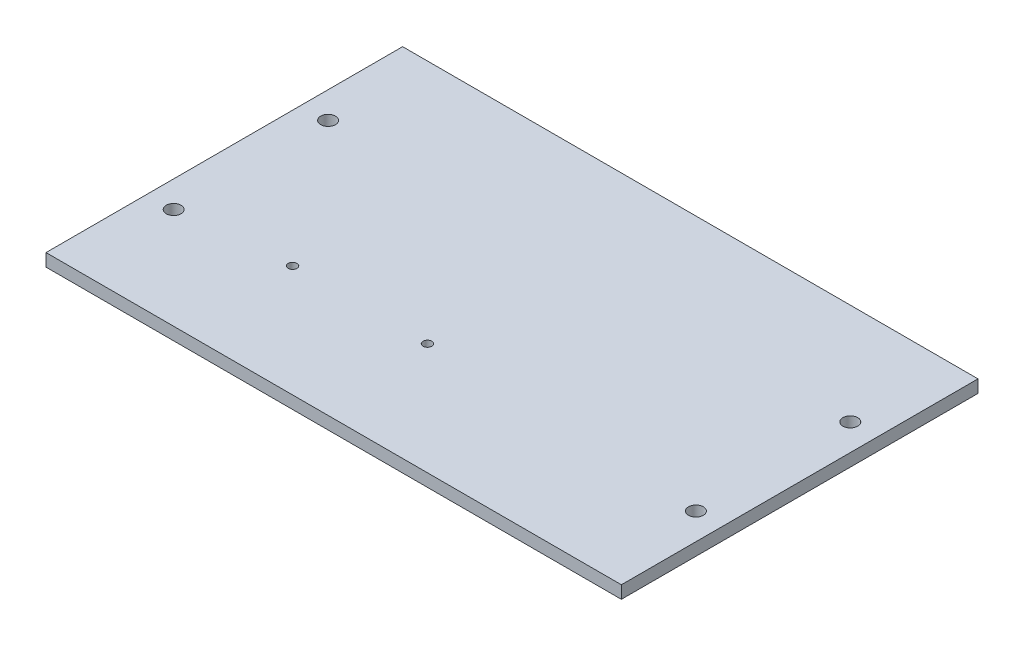
ISO-10303-21;
HEADER;
FILE_DESCRIPTION(('STEP AP214'),'2;1');
FILE_NAME('part.step','',(''),(''),'','','');
FILE_SCHEMA(('AUTOMOTIVE_DESIGN { 1 0 10303 214 1 1 1 1 }'));
ENDSEC;
DATA;
#1=APPLICATION_CONTEXT('core data for automotive mechanical design processes');
#2=APPLICATION_PROTOCOL_DEFINITION('international standard','automotive_design',2000,#1);
#3=PRODUCT_CONTEXT('',#1,'mechanical');
#4=PRODUCT('Part','Part','',(#3));
#5=PRODUCT_RELATED_PRODUCT_CATEGORY('part','',(#4));
#6=PRODUCT_DEFINITION_FORMATION('','',#4);
#7=PRODUCT_DEFINITION_CONTEXT('part definition',#1,'design');
#8=PRODUCT_DEFINITION('design','',#6,#7);
#9=PRODUCT_DEFINITION_SHAPE('','',#8);
#10=(LENGTH_UNIT() NAMED_UNIT(*) SI_UNIT(.MILLI.,.METRE.));
#11=(NAMED_UNIT(*) PLANE_ANGLE_UNIT() SI_UNIT($,.RADIAN.));
#12=(NAMED_UNIT(*) SI_UNIT($,.STERADIAN.) SOLID_ANGLE_UNIT());
#13=UNCERTAINTY_MEASURE_WITH_UNIT(LENGTH_MEASURE(1.E-05),#10,'distance_accuracy_value','');
#14=(GEOMETRIC_REPRESENTATION_CONTEXT(3) GLOBAL_UNCERTAINTY_ASSIGNED_CONTEXT((#13)) GLOBAL_UNIT_ASSIGNED_CONTEXT((#10,
#11,#12)) REPRESENTATION_CONTEXT('',''));
#15=CARTESIAN_POINT('',(0.,0.,0.));
#16=DIRECTION('',(0.,0.,1.));
#17=DIRECTION('',(1.,0.,0.));
#18=AXIS2_PLACEMENT_3D('',#15,#16,#17);
#19=CARTESIAN_POINT('',(0.,4.7625,0.));
#20=DIRECTION('',(0.,-1.,0.));
#21=DIRECTION('',(0.,0.,-1.));
#22=AXIS2_PLACEMENT_3D('',#19,#20,#21);
#23=PLANE('',#22);
#24=DIRECTION('',(0.,0.,1.));
#25=VECTOR('',#24,1.);
#26=CARTESIAN_POINT('',(0.,4.7625,0.));
#27=LINE('',#26,#25);
#28=CARTESIAN_POINT('',(0.,4.7625,-134.366));
#29=VERTEX_POINT('',#28);
#30=CARTESIAN_POINT('',(0.,4.7625,0.));
#31=VERTEX_POINT('',#30);
#32=EDGE_CURVE('E88',#29,#31,#27,.T.);
#33=ORIENTED_EDGE('',*,*,#32,.T.);
#34=DIRECTION('',(1.,0.,0.));
#35=VECTOR('',#34,1.);
#36=CARTESIAN_POINT('',(0.,4.7625,0.));
#37=LINE('',#36,#35);
#38=CARTESIAN_POINT('',(216.78392,4.7625,0.));
#39=VERTEX_POINT('',#38);
#40=EDGE_CURVE('E83',#31,#39,#37,.T.);
#41=ORIENTED_EDGE('',*,*,#40,.T.);
#42=DIRECTION('',(0.,0.,-1.));
#43=VECTOR('',#42,1.);
#44=CARTESIAN_POINT('',(216.78392,4.7625,0.));
#45=LINE('',#44,#43);
#46=CARTESIAN_POINT('',(216.78392,4.7625,-134.366));
#47=VERTEX_POINT('',#46);
#48=EDGE_CURVE('E86',#39,#47,#45,.T.);
#49=ORIENTED_EDGE('',*,*,#48,.T.);
#50=DIRECTION('',(-1.,0.,0.));
#51=VECTOR('',#50,1.);
#52=CARTESIAN_POINT('',(0.,4.7625,-134.366));
#53=LINE('',#52,#51);
#54=EDGE_CURVE('E53',#47,#29,#53,.T.);
#55=ORIENTED_EDGE('',*,*,#54,.T.);
#56=EDGE_LOOP('',(#33,#41,#49,#55));
#57=FACE_BOUND('',#56,.T.);
#58=CARTESIAN_POINT('',(50.8,4.7625,-42.1006735287375));
#59=DIRECTION('',(0.,1.,0.));
#60=DIRECTION('',(0.,0.,1.));
#61=AXIS2_PLACEMENT_3D('',#58,#59,#60);
#62=CIRCLE('',#61,1.65100000000001);
#63=CARTESIAN_POINT('',(50.8,4.7625,-43.7516735287375));
#64=VERTEX_POINT('',#63);
#65=EDGE_CURVE('E103',#64,#64,#62,.T.);
#66=ORIENTED_EDGE('',*,*,#65,.F.);
#67=EDGE_LOOP('',(#66));
#68=FACE_BOUND('',#67,.T.);
#69=CARTESIAN_POINT('',(101.6,4.7625,-42.1006735287375));
#70=DIRECTION('',(0.,1.,0.));
#71=DIRECTION('',(0.,0.,1.));
#72=AXIS2_PLACEMENT_3D('',#69,#70,#71);
#73=CIRCLE('',#72,1.65100000000002);
#74=CARTESIAN_POINT('',(101.6,4.7625,-43.7516735287375));
#75=VERTEX_POINT('',#74);
#76=EDGE_CURVE('E118',#75,#75,#73,.T.);
#77=ORIENTED_EDGE('',*,*,#76,.F.);
#78=EDGE_LOOP('',(#77));
#79=FACE_BOUND('',#78,.T.);
#80=CARTESIAN_POINT('',(10.0076,4.7625,-96.266));
#81=DIRECTION('',(0.,1.,0.));
#82=DIRECTION('',(0.,0.,1.));
#83=AXIS2_PLACEMENT_3D('',#80,#81,#82);
#84=CIRCLE('',#83,2.794);
#85=CARTESIAN_POINT('',(10.0076,4.7625,-99.06));
#86=VERTEX_POINT('',#85);
#87=EDGE_CURVE('E124',#86,#86,#84,.T.);
#88=ORIENTED_EDGE('',*,*,#87,.F.);
#89=EDGE_LOOP('',(#88));
#90=FACE_BOUND('',#89,.T.);
#91=CARTESIAN_POINT('',(10.0076,4.7625,-38.1));
#92=DIRECTION('',(0.,1.,0.));
#93=DIRECTION('',(0.,0.,1.));
#94=AXIS2_PLACEMENT_3D('',#91,#92,#93);
#95=CIRCLE('',#94,2.794);
#96=CARTESIAN_POINT('',(10.0076,4.7625,-40.894));
#97=VERTEX_POINT('',#96);
#98=EDGE_CURVE('E130',#97,#97,#95,.T.);
#99=ORIENTED_EDGE('',*,*,#98,.F.);
#100=EDGE_LOOP('',(#99));
#101=FACE_BOUND('',#100,.T.);
#102=CARTESIAN_POINT('',(206.77632,4.7625,-96.266));
#103=DIRECTION('',(0.,1.,0.));
#104=DIRECTION('',(0.,0.,1.));
#105=AXIS2_PLACEMENT_3D('',#102,#103,#104);
#106=CIRCLE('',#105,2.79399999999998);
#107=CARTESIAN_POINT('',(206.77632,4.7625,-99.06));
#108=VERTEX_POINT('',#107);
#109=EDGE_CURVE('E136',#108,#108,#106,.T.);
#110=ORIENTED_EDGE('',*,*,#109,.F.);
#111=EDGE_LOOP('',(#110));
#112=FACE_BOUND('',#111,.T.);
#113=CARTESIAN_POINT('',(206.77632,4.7625,-38.1));
#114=DIRECTION('',(0.,1.,0.));
#115=DIRECTION('',(0.,0.,1.));
#116=AXIS2_PLACEMENT_3D('',#113,#114,#115);
#117=CIRCLE('',#116,2.79399999999998);
#118=CARTESIAN_POINT('',(206.77632,4.7625,-40.894));
#119=VERTEX_POINT('',#118);
#120=EDGE_CURVE('E142',#119,#119,#117,.T.);
#121=ORIENTED_EDGE('',*,*,#120,.F.);
#122=EDGE_LOOP('',(#121));
#123=FACE_BOUND('',#122,.T.);
#124=ADVANCED_FACE('F36',(#57,#68,#79,#90,#101,#112,#123),#23,.F.);
#125=CARTESIAN_POINT('',(0.,0.,0.));
#126=DIRECTION('',(0.,-1.,0.));
#127=DIRECTION('',(0.,0.,-1.));
#128=AXIS2_PLACEMENT_3D('',#125,#126,#127);
#129=PLANE('',#128);
#130=CARTESIAN_POINT('',(206.77632,0.,-96.266));
#131=DIRECTION('',(0.,1.,0.));
#132=DIRECTION('',(0.,0.,1.));
#133=AXIS2_PLACEMENT_3D('',#130,#131,#132);
#134=CIRCLE('',#133,2.79399999999998);
#135=CARTESIAN_POINT('',(206.77632,0.,-99.06));
#136=VERTEX_POINT('',#135);
#137=EDGE_CURVE('E139',#136,#136,#134,.T.);
#138=ORIENTED_EDGE('',*,*,#137,.T.);
#139=EDGE_LOOP('',(#138));
#140=FACE_BOUND('',#139,.T.);
#141=CARTESIAN_POINT('',(10.0076,0.,-96.266));
#142=DIRECTION('',(0.,1.,0.));
#143=DIRECTION('',(0.,0.,1.));
#144=AXIS2_PLACEMENT_3D('',#141,#142,#143);
#145=CIRCLE('',#144,2.794);
#146=CARTESIAN_POINT('',(10.0076,0.,-99.06));
#147=VERTEX_POINT('',#146);
#148=EDGE_CURVE('E127',#147,#147,#145,.T.);
#149=ORIENTED_EDGE('',*,*,#148,.T.);
#150=EDGE_LOOP('',(#149));
#151=FACE_BOUND('',#150,.T.);
#152=CARTESIAN_POINT('',(50.8,0.,-42.1006735287375));
#153=DIRECTION('',(0.,1.,0.));
#154=DIRECTION('',(0.,0.,1.));
#155=AXIS2_PLACEMENT_3D('',#152,#153,#154);
#156=CIRCLE('',#155,1.65100000000001);
#157=CARTESIAN_POINT('',(50.8,0.,-43.7516735287375));
#158=VERTEX_POINT('',#157);
#159=EDGE_CURVE('E115',#158,#158,#156,.T.);
#160=ORIENTED_EDGE('',*,*,#159,.T.);
#161=EDGE_LOOP('',(#160));
#162=FACE_BOUND('',#161,.T.);
#163=DIRECTION('',(0.,0.,1.));
#164=VECTOR('',#163,1.);
#165=CARTESIAN_POINT('',(0.,0.,0.));
#166=LINE('',#165,#164);
#167=CARTESIAN_POINT('',(0.,0.,-134.366));
#168=VERTEX_POINT('',#167);
#169=CARTESIAN_POINT('',(0.,0.,0.));
#170=VERTEX_POINT('',#169);
#171=EDGE_CURVE('E100',#168,#170,#166,.T.);
#172=ORIENTED_EDGE('',*,*,#171,.F.);
#173=DIRECTION('',(-1.,0.,0.));
#174=VECTOR('',#173,1.);
#175=CARTESIAN_POINT('',(0.,0.,-134.366));
#176=LINE('',#175,#174);
#177=CARTESIAN_POINT('',(216.78392,0.,-134.366));
#178=VERTEX_POINT('',#177);
#179=EDGE_CURVE('E76',#178,#168,#176,.T.);
#180=ORIENTED_EDGE('',*,*,#179,.F.);
#181=DIRECTION('',(0.,0.,-1.));
#182=VECTOR('',#181,1.);
#183=CARTESIAN_POINT('',(216.78392,0.,0.));
#184=LINE('',#183,#182);
#185=CARTESIAN_POINT('',(216.78392,0.,0.));
#186=VERTEX_POINT('',#185);
#187=EDGE_CURVE('E70',#186,#178,#184,.T.);
#188=ORIENTED_EDGE('',*,*,#187,.F.);
#189=DIRECTION('',(1.,0.,0.));
#190=VECTOR('',#189,1.);
#191=CARTESIAN_POINT('',(0.,0.,0.));
#192=LINE('',#191,#190);
#193=EDGE_CURVE('E92',#170,#186,#192,.T.);
#194=ORIENTED_EDGE('',*,*,#193,.F.);
#195=EDGE_LOOP('',(#172,#180,#188,#194));
#196=FACE_BOUND('',#195,.T.);
#197=CARTESIAN_POINT('',(101.6,0.,-42.1006735287375));
#198=DIRECTION('',(0.,1.,0.));
#199=DIRECTION('',(0.,0.,1.));
#200=AXIS2_PLACEMENT_3D('',#197,#198,#199);
#201=CIRCLE('',#200,1.65100000000002);
#202=CARTESIAN_POINT('',(101.6,0.,-43.7516735287375));
#203=VERTEX_POINT('',#202);
#204=EDGE_CURVE('E121',#203,#203,#201,.T.);
#205=ORIENTED_EDGE('',*,*,#204,.T.);
#206=EDGE_LOOP('',(#205));
#207=FACE_BOUND('',#206,.T.);
#208=CARTESIAN_POINT('',(10.0076,0.,-38.1));
#209=DIRECTION('',(0.,1.,0.));
#210=DIRECTION('',(0.,0.,1.));
#211=AXIS2_PLACEMENT_3D('',#208,#209,#210);
#212=CIRCLE('',#211,2.794);
#213=CARTESIAN_POINT('',(10.0076,0.,-40.894));
#214=VERTEX_POINT('',#213);
#215=EDGE_CURVE('E133',#214,#214,#212,.T.);
#216=ORIENTED_EDGE('',*,*,#215,.T.);
#217=EDGE_LOOP('',(#216));
#218=FACE_BOUND('',#217,.T.);
#219=CARTESIAN_POINT('',(206.77632,0.,-38.1));
#220=DIRECTION('',(0.,1.,0.));
#221=DIRECTION('',(0.,0.,1.));
#222=AXIS2_PLACEMENT_3D('',#219,#220,#221);
#223=CIRCLE('',#222,2.79399999999998);
#224=CARTESIAN_POINT('',(206.77632,0.,-40.894));
#225=VERTEX_POINT('',#224);
#226=EDGE_CURVE('E145',#225,#225,#223,.T.);
#227=ORIENTED_EDGE('',*,*,#226,.T.);
#228=EDGE_LOOP('',(#227));
#229=FACE_BOUND('',#228,.T.);
#230=ADVANCED_FACE('F111',(#140,#151,#162,#196,#207,#218,#229),#129,.T.);
#231=CARTESIAN_POINT('',(0.,4.7625,0.));
#232=DIRECTION('',(1.,0.,0.));
#233=DIRECTION('',(0.,0.,-1.));
#234=AXIS2_PLACEMENT_3D('',#231,#232,#233);
#235=PLANE('',#234);
#236=ORIENTED_EDGE('',*,*,#171,.T.);
#237=DIRECTION('',(0.,-1.,0.));
#238=VECTOR('',#237,1.);
#239=CARTESIAN_POINT('',(0.,4.7625,0.));
#240=LINE('',#239,#238);
#241=EDGE_CURVE('E11',#31,#170,#240,.T.);
#242=ORIENTED_EDGE('',*,*,#241,.F.);
#243=ORIENTED_EDGE('',*,*,#32,.F.);
#244=DIRECTION('',(0.,-1.,0.));
#245=VECTOR('',#244,1.);
#246=CARTESIAN_POINT('',(0.,4.7625,-134.366));
#247=LINE('',#246,#245);
#248=EDGE_CURVE('E96',#29,#168,#247,.T.);
#249=ORIENTED_EDGE('',*,*,#248,.T.);
#250=EDGE_LOOP('',(#236,#242,#243,#249));
#251=FACE_BOUND('',#250,.T.);
#252=ADVANCED_FACE('F38',(#251),#235,.F.);
#253=CARTESIAN_POINT('',(0.,4.7625,0.));
#254=DIRECTION('',(0.,0.,-1.));
#255=DIRECTION('',(-1.,0.,0.));
#256=AXIS2_PLACEMENT_3D('',#253,#254,#255);
#257=PLANE('',#256);
#258=ORIENTED_EDGE('',*,*,#193,.T.);
#259=DIRECTION('',(0.,-1.,0.));
#260=VECTOR('',#259,1.);
#261=CARTESIAN_POINT('',(216.78392,4.7625,0.));
#262=LINE('',#261,#260);
#263=EDGE_CURVE('E45',#39,#186,#262,.T.);
#264=ORIENTED_EDGE('',*,*,#263,.F.);
#265=ORIENTED_EDGE('',*,*,#40,.F.);
#266=ORIENTED_EDGE('',*,*,#241,.T.);
#267=EDGE_LOOP('',(#258,#264,#265,#266));
#268=FACE_BOUND('',#267,.T.);
#269=ADVANCED_FACE('F91',(#268),#257,.F.);
#270=CARTESIAN_POINT('',(216.78392,4.7625,0.));
#271=DIRECTION('',(-1.,0.,0.));
#272=DIRECTION('',(0.,0.,1.));
#273=AXIS2_PLACEMENT_3D('',#270,#271,#272);
#274=PLANE('',#273);
#275=ORIENTED_EDGE('',*,*,#187,.T.);
#276=DIRECTION('',(0.,-1.,0.));
#277=VECTOR('',#276,1.);
#278=CARTESIAN_POINT('',(216.78392,4.7625,-134.366));
#279=LINE('',#278,#277);
#280=EDGE_CURVE('E93',#47,#178,#279,.T.);
#281=ORIENTED_EDGE('',*,*,#280,.F.);
#282=ORIENTED_EDGE('',*,*,#48,.F.);
#283=ORIENTED_EDGE('',*,*,#263,.T.);
#284=EDGE_LOOP('',(#275,#281,#282,#283));
#285=FACE_BOUND('',#284,.T.);
#286=ADVANCED_FACE('F94',(#285),#274,.F.);
#287=CARTESIAN_POINT('',(0.,4.7625,-134.366));
#288=DIRECTION('',(0.,0.,1.));
#289=DIRECTION('',(1.,0.,0.));
#290=AXIS2_PLACEMENT_3D('',#287,#288,#289);
#291=PLANE('',#290);
#292=ORIENTED_EDGE('',*,*,#179,.T.);
#293=ORIENTED_EDGE('',*,*,#248,.F.);
#294=ORIENTED_EDGE('',*,*,#54,.F.);
#295=ORIENTED_EDGE('',*,*,#280,.T.);
#296=EDGE_LOOP('',(#292,#293,#294,#295));
#297=FACE_BOUND('',#296,.T.);
#298=ADVANCED_FACE('F108',(#297),#291,.F.);
#299=CARTESIAN_POINT('',(50.8,4.7625,-42.1006735287375));
#300=DIRECTION('',(0.,-1.,0.));
#301=DIRECTION('',(0.,0.,-1.));
#302=AXIS2_PLACEMENT_3D('',#299,#300,#301);
#303=CYLINDRICAL_SURFACE('',#302,1.65100000000001);
#304=CARTESIAN_POINT('',(50.8,4.7625,-43.7516735287375));
#305=CARTESIAN_POINT('',(50.8,4.712890625,-43.7516735287375));
#306=CARTESIAN_POINT('',(50.8,4.66328125,-43.7516735287375));
#307=CARTESIAN_POINT('',(50.8,4.5640625,-43.7516735287375));
#308=CARTESIAN_POINT('',(50.8,4.514453125,-43.7516735287375));
#309=CARTESIAN_POINT('',(50.8,4.415234375,-43.7516735287375));
#310=CARTESIAN_POINT('',(50.8,4.365625,-43.7516735287375));
#311=CARTESIAN_POINT('',(50.8,4.26640625,-43.7516735287375));
#312=CARTESIAN_POINT('',(50.8,4.216796875,-43.7516735287375));
#313=CARTESIAN_POINT('',(50.8,4.117578125,-43.7516735287375));
#314=CARTESIAN_POINT('',(50.8,4.06796875,-43.7516735287375));
#315=CARTESIAN_POINT('',(50.8,3.96875,-43.7516735287375));
#316=CARTESIAN_POINT('',(50.8,3.919140625,-43.7516735287375));
#317=CARTESIAN_POINT('',(50.8,3.819921875,-43.7516735287375));
#318=CARTESIAN_POINT('',(50.8,3.7703125,-43.7516735287375));
#319=CARTESIAN_POINT('',(50.8,3.67109375,-43.7516735287375));
#320=CARTESIAN_POINT('',(50.8,3.621484375,-43.7516735287375));
#321=CARTESIAN_POINT('',(50.8,3.522265625,-43.7516735287375));
#322=CARTESIAN_POINT('',(50.8,3.47265625,-43.7516735287375));
#323=CARTESIAN_POINT('',(50.8,3.3734375,-43.7516735287375));
#324=CARTESIAN_POINT('',(50.8,3.323828125,-43.7516735287375));
#325=CARTESIAN_POINT('',(50.8,3.224609375,-43.7516735287375));
#326=CARTESIAN_POINT('',(50.8,3.175,-43.7516735287375));
#327=CARTESIAN_POINT('',(50.8,3.07578125,-43.7516735287375));
#328=CARTESIAN_POINT('',(50.8,3.026171875,-43.7516735287375));
#329=CARTESIAN_POINT('',(50.8,2.926953125,-43.7516735287375));
#330=CARTESIAN_POINT('',(50.8,2.87734375,-43.7516735287375));
#331=CARTESIAN_POINT('',(50.8,2.778125,-43.7516735287375));
#332=CARTESIAN_POINT('',(50.8,2.728515625,-43.7516735287375));
#333=CARTESIAN_POINT('',(50.8,2.629296875,-43.7516735287375));
#334=CARTESIAN_POINT('',(50.8,2.5796875,-43.7516735287375));
#335=CARTESIAN_POINT('',(50.8,2.48046875,-43.7516735287375));
#336=CARTESIAN_POINT('',(50.8,2.430859375,-43.7516735287375));
#337=CARTESIAN_POINT('',(50.8,2.331640625,-43.7516735287375));
#338=CARTESIAN_POINT('',(50.8,2.28203125,-43.7516735287375));
#339=CARTESIAN_POINT('',(50.8,2.1828125,-43.7516735287375));
#340=CARTESIAN_POINT('',(50.8,2.133203125,-43.7516735287375));
#341=CARTESIAN_POINT('',(50.8,2.033984375,-43.7516735287375));
#342=CARTESIAN_POINT('',(50.8,1.984375,-43.7516735287375));
#343=CARTESIAN_POINT('',(50.8,1.88515625,-43.7516735287375));
#344=CARTESIAN_POINT('',(50.8,1.835546875,-43.7516735287375));
#345=CARTESIAN_POINT('',(50.8,1.736328125,-43.7516735287375));
#346=CARTESIAN_POINT('',(50.8,1.68671875,-43.7516735287375));
#347=CARTESIAN_POINT('',(50.8,1.5875,-43.7516735287375));
#348=CARTESIAN_POINT('',(50.8,1.537890625,-43.7516735287375));
#349=CARTESIAN_POINT('',(50.8,1.438671875,-43.7516735287375));
#350=CARTESIAN_POINT('',(50.8,1.3890625,-43.7516735287375));
#351=CARTESIAN_POINT('',(50.8,1.28984375,-43.7516735287375));
#352=CARTESIAN_POINT('',(50.8,1.240234375,-43.7516735287375));
#353=CARTESIAN_POINT('',(50.8,1.141015625,-43.7516735287375));
#354=CARTESIAN_POINT('',(50.8,1.09140625,-43.7516735287375));
#355=CARTESIAN_POINT('',(50.8,0.9921875,-43.7516735287375));
#356=CARTESIAN_POINT('',(50.8,0.942578125,-43.7516735287375));
#357=CARTESIAN_POINT('',(50.8,0.843359375,-43.7516735287375));
#358=CARTESIAN_POINT('',(50.8,0.79375,-43.7516735287375));
#359=CARTESIAN_POINT('',(50.8,0.69453125,-43.7516735287375));
#360=CARTESIAN_POINT('',(50.8,0.644921875,-43.7516735287375));
#361=CARTESIAN_POINT('',(50.8,0.545703125,-43.7516735287375));
#362=CARTESIAN_POINT('',(50.8,0.49609375,-43.7516735287375));
#363=CARTESIAN_POINT('',(50.8,0.396875,-43.7516735287375));
#364=CARTESIAN_POINT('',(50.8,0.347265625,-43.7516735287375));
#365=CARTESIAN_POINT('',(50.8,0.248046875,-43.7516735287375));
#366=CARTESIAN_POINT('',(50.8,0.1984375,-43.7516735287375));
#367=CARTESIAN_POINT('',(50.8,0.09921875,-43.7516735287375));
#368=CARTESIAN_POINT('',(50.8,0.049609375,-43.7516735287375));
#369=CARTESIAN_POINT('',(50.8,0.,-43.7516735287375));
#370=B_SPLINE_CURVE_WITH_KNOTS('',3,(#304,#305,#306,#307,#308,#309,#310,#311,#312,#313,#314,
#315,#316,#317,#318,#319,#320,#321,#322,#323,#324,#325,#326,#327,#328,#329,#330,#331,#332,#333,
#334,#335,#336,#337,#338,#339,#340,#341,#342,#343,#344,#345,#346,#347,#348,#349,#350,#351,#352,
#353,#354,#355,#356,#357,#358,#359,#360,#361,#362,#363,#364,#365,#366,#367,#368,#369),
.UNSPECIFIED.,.F.,.F.,(4,2,2,2,2,2,2,2,2,2,2,2,2,2,2,2,2,2,2,2,2,2,2,2,2,2,2,2,2,2,2,2,4),(0.,
0.148828124999999,0.297656249999999,0.446484374999999,0.595312499999999,0.744140625,0.89296875,
1.041796875,1.190625,1.339453125,1.48828125,1.637109375,1.7859375,1.934765625,2.08359375,
2.232421875,2.38125,2.530078125,2.67890625,2.827734375,2.9765625,3.125390625,3.27421875,
3.423046875,3.571875,3.720703125,3.86953125,4.018359375,4.1671875,4.316015625,4.46484375,
4.613671875,4.7625),.UNSPECIFIED.);
#371=EDGE_CURVE('BSEAM162',#64,#158,#370,.T.);
#372=ORIENTED_EDGE('',*,*,#65,.T.);
#373=ORIENTED_EDGE('',*,*,#159,.F.);
#374=ORIENTED_EDGE('',*,*,#371,.T.);
#375=ORIENTED_EDGE('',*,*,#371,.F.);
#376=EDGE_LOOP('',(#372,#374,#373,#375));
#377=FACE_BOUND('',#376,.T.);
#378=ADVANCED_FACE('F162',(#377),#303,.F.);
#379=CARTESIAN_POINT('',(101.6,4.7625,-42.1006735287375));
#380=DIRECTION('',(0.,-1.,0.));
#381=DIRECTION('',(0.,0.,-1.));
#382=AXIS2_PLACEMENT_3D('',#379,#380,#381);
#383=CYLINDRICAL_SURFACE('',#382,1.65100000000002);
#384=CARTESIAN_POINT('',(101.6,4.7625,-43.7516735287375));
#385=CARTESIAN_POINT('',(101.6,4.712890625,-43.7516735287375));
#386=CARTESIAN_POINT('',(101.6,4.66328125,-43.7516735287375));
#387=CARTESIAN_POINT('',(101.6,4.5640625,-43.7516735287375));
#388=CARTESIAN_POINT('',(101.6,4.514453125,-43.7516735287375));
#389=CARTESIAN_POINT('',(101.6,4.415234375,-43.7516735287375));
#390=CARTESIAN_POINT('',(101.6,4.365625,-43.7516735287375));
#391=CARTESIAN_POINT('',(101.6,4.26640625,-43.7516735287375));
#392=CARTESIAN_POINT('',(101.6,4.216796875,-43.7516735287375));
#393=CARTESIAN_POINT('',(101.6,4.117578125,-43.7516735287375));
#394=CARTESIAN_POINT('',(101.6,4.06796875,-43.7516735287375));
#395=CARTESIAN_POINT('',(101.6,3.96875,-43.7516735287375));
#396=CARTESIAN_POINT('',(101.6,3.919140625,-43.7516735287375));
#397=CARTESIAN_POINT('',(101.6,3.819921875,-43.7516735287375));
#398=CARTESIAN_POINT('',(101.6,3.7703125,-43.7516735287375));
#399=CARTESIAN_POINT('',(101.6,3.67109375,-43.7516735287375));
#400=CARTESIAN_POINT('',(101.6,3.621484375,-43.7516735287375));
#401=CARTESIAN_POINT('',(101.6,3.522265625,-43.7516735287375));
#402=CARTESIAN_POINT('',(101.6,3.47265625,-43.7516735287375));
#403=CARTESIAN_POINT('',(101.6,3.3734375,-43.7516735287375));
#404=CARTESIAN_POINT('',(101.6,3.323828125,-43.7516735287375));
#405=CARTESIAN_POINT('',(101.6,3.224609375,-43.7516735287375));
#406=CARTESIAN_POINT('',(101.6,3.175,-43.7516735287375));
#407=CARTESIAN_POINT('',(101.6,3.07578125,-43.7516735287375));
#408=CARTESIAN_POINT('',(101.6,3.026171875,-43.7516735287375));
#409=CARTESIAN_POINT('',(101.6,2.926953125,-43.7516735287375));
#410=CARTESIAN_POINT('',(101.6,2.87734375,-43.7516735287375));
#411=CARTESIAN_POINT('',(101.6,2.778125,-43.7516735287375));
#412=CARTESIAN_POINT('',(101.6,2.728515625,-43.7516735287375));
#413=CARTESIAN_POINT('',(101.6,2.629296875,-43.7516735287375));
#414=CARTESIAN_POINT('',(101.6,2.5796875,-43.7516735287375));
#415=CARTESIAN_POINT('',(101.6,2.48046875,-43.7516735287375));
#416=CARTESIAN_POINT('',(101.6,2.430859375,-43.7516735287375));
#417=CARTESIAN_POINT('',(101.6,2.331640625,-43.7516735287375));
#418=CARTESIAN_POINT('',(101.6,2.28203125,-43.7516735287375));
#419=CARTESIAN_POINT('',(101.6,2.1828125,-43.7516735287375));
#420=CARTESIAN_POINT('',(101.6,2.133203125,-43.7516735287375));
#421=CARTESIAN_POINT('',(101.6,2.033984375,-43.7516735287375));
#422=CARTESIAN_POINT('',(101.6,1.984375,-43.7516735287375));
#423=CARTESIAN_POINT('',(101.6,1.88515625,-43.7516735287375));
#424=CARTESIAN_POINT('',(101.6,1.835546875,-43.7516735287375));
#425=CARTESIAN_POINT('',(101.6,1.736328125,-43.7516735287375));
#426=CARTESIAN_POINT('',(101.6,1.68671875,-43.7516735287375));
#427=CARTESIAN_POINT('',(101.6,1.5875,-43.7516735287375));
#428=CARTESIAN_POINT('',(101.6,1.537890625,-43.7516735287375));
#429=CARTESIAN_POINT('',(101.6,1.438671875,-43.7516735287375));
#430=CARTESIAN_POINT('',(101.6,1.3890625,-43.7516735287375));
#431=CARTESIAN_POINT('',(101.6,1.28984375,-43.7516735287375));
#432=CARTESIAN_POINT('',(101.6,1.240234375,-43.7516735287375));
#433=CARTESIAN_POINT('',(101.6,1.141015625,-43.7516735287375));
#434=CARTESIAN_POINT('',(101.6,1.09140625,-43.7516735287375));
#435=CARTESIAN_POINT('',(101.6,0.9921875,-43.7516735287375));
#436=CARTESIAN_POINT('',(101.6,0.942578125,-43.7516735287375));
#437=CARTESIAN_POINT('',(101.6,0.843359375,-43.7516735287375));
#438=CARTESIAN_POINT('',(101.6,0.79375,-43.7516735287375));
#439=CARTESIAN_POINT('',(101.6,0.69453125,-43.7516735287375));
#440=CARTESIAN_POINT('',(101.6,0.644921875,-43.7516735287375));
#441=CARTESIAN_POINT('',(101.6,0.545703125,-43.7516735287375));
#442=CARTESIAN_POINT('',(101.6,0.49609375,-43.7516735287375));
#443=CARTESIAN_POINT('',(101.6,0.396875,-43.7516735287375));
#444=CARTESIAN_POINT('',(101.6,0.347265625,-43.7516735287375));
#445=CARTESIAN_POINT('',(101.6,0.248046875,-43.7516735287375));
#446=CARTESIAN_POINT('',(101.6,0.1984375,-43.7516735287375));
#447=CARTESIAN_POINT('',(101.6,0.09921875,-43.7516735287375));
#448=CARTESIAN_POINT('',(101.6,0.049609375,-43.7516735287375));
#449=CARTESIAN_POINT('',(101.6,0.,-43.7516735287375));
#450=B_SPLINE_CURVE_WITH_KNOTS('',3,(#384,#385,#386,#387,#388,#389,#390,#391,#392,#393,#394,
#395,#396,#397,#398,#399,#400,#401,#402,#403,#404,#405,#406,#407,#408,#409,#410,#411,#412,#413,
#414,#415,#416,#417,#418,#419,#420,#421,#422,#423,#424,#425,#426,#427,#428,#429,#430,#431,#432,
#433,#434,#435,#436,#437,#438,#439,#440,#441,#442,#443,#444,#445,#446,#447,#448,#449),
.UNSPECIFIED.,.F.,.F.,(4,2,2,2,2,2,2,2,2,2,2,2,2,2,2,2,2,2,2,2,2,2,2,2,2,2,2,2,2,2,2,2,4),(0.,
0.148828124999999,0.297656249999999,0.446484374999999,0.595312499999999,0.744140625,0.89296875,
1.041796875,1.190625,1.339453125,1.48828125,1.637109375,1.7859375,1.934765625,2.08359375,
2.232421875,2.38125,2.530078125,2.67890625,2.827734375,2.9765625,3.125390625,3.27421875,
3.423046875,3.571875,3.720703125,3.86953125,4.018359375,4.1671875,4.316015625,4.46484375,
4.613671875,4.7625),.UNSPECIFIED.);
#451=EDGE_CURVE('BSEAM216',#75,#203,#450,.T.);
#452=ORIENTED_EDGE('',*,*,#76,.T.);
#453=ORIENTED_EDGE('',*,*,#204,.F.);
#454=ORIENTED_EDGE('',*,*,#451,.T.);
#455=ORIENTED_EDGE('',*,*,#451,.F.);
#456=EDGE_LOOP('',(#452,#454,#453,#455));
#457=FACE_BOUND('',#456,.T.);
#458=ADVANCED_FACE('F216',(#457),#383,.F.);
#459=CARTESIAN_POINT('',(10.0076,4.7625,-96.266));
#460=DIRECTION('',(0.,-1.,0.));
#461=DIRECTION('',(0.,0.,-1.));
#462=AXIS2_PLACEMENT_3D('',#459,#460,#461);
#463=CYLINDRICAL_SURFACE('',#462,2.794);
#464=CARTESIAN_POINT('',(10.0076,4.7625,-99.06));
#465=CARTESIAN_POINT('',(10.0076,4.712890625,-99.06));
#466=CARTESIAN_POINT('',(10.0076,4.66328125,-99.06));
#467=CARTESIAN_POINT('',(10.0076,4.5640625,-99.06));
#468=CARTESIAN_POINT('',(10.0076,4.514453125,-99.06));
#469=CARTESIAN_POINT('',(10.0076,4.415234375,-99.06));
#470=CARTESIAN_POINT('',(10.0076,4.365625,-99.06));
#471=CARTESIAN_POINT('',(10.0076,4.26640625,-99.06));
#472=CARTESIAN_POINT('',(10.0076,4.216796875,-99.06));
#473=CARTESIAN_POINT('',(10.0076,4.117578125,-99.06));
#474=CARTESIAN_POINT('',(10.0076,4.06796875,-99.06));
#475=CARTESIAN_POINT('',(10.0076,3.96875,-99.06));
#476=CARTESIAN_POINT('',(10.0076,3.919140625,-99.06));
#477=CARTESIAN_POINT('',(10.0076,3.819921875,-99.06));
#478=CARTESIAN_POINT('',(10.0076,3.7703125,-99.06));
#479=CARTESIAN_POINT('',(10.0076,3.67109375,-99.06));
#480=CARTESIAN_POINT('',(10.0076,3.621484375,-99.06));
#481=CARTESIAN_POINT('',(10.0076,3.522265625,-99.06));
#482=CARTESIAN_POINT('',(10.0076,3.47265625,-99.06));
#483=CARTESIAN_POINT('',(10.0076,3.3734375,-99.06));
#484=CARTESIAN_POINT('',(10.0076,3.323828125,-99.06));
#485=CARTESIAN_POINT('',(10.0076,3.224609375,-99.06));
#486=CARTESIAN_POINT('',(10.0076,3.175,-99.06));
#487=CARTESIAN_POINT('',(10.0076,3.07578125,-99.06));
#488=CARTESIAN_POINT('',(10.0076,3.026171875,-99.06));
#489=CARTESIAN_POINT('',(10.0076,2.926953125,-99.06));
#490=CARTESIAN_POINT('',(10.0076,2.87734375,-99.06));
#491=CARTESIAN_POINT('',(10.0076,2.778125,-99.06));
#492=CARTESIAN_POINT('',(10.0076,2.728515625,-99.06));
#493=CARTESIAN_POINT('',(10.0076,2.629296875,-99.06));
#494=CARTESIAN_POINT('',(10.0076,2.5796875,-99.06));
#495=CARTESIAN_POINT('',(10.0076,2.48046875,-99.06));
#496=CARTESIAN_POINT('',(10.0076,2.430859375,-99.06));
#497=CARTESIAN_POINT('',(10.0076,2.331640625,-99.06));
#498=CARTESIAN_POINT('',(10.0076,2.28203125,-99.06));
#499=CARTESIAN_POINT('',(10.0076,2.1828125,-99.06));
#500=CARTESIAN_POINT('',(10.0076,2.133203125,-99.06));
#501=CARTESIAN_POINT('',(10.0076,2.033984375,-99.06));
#502=CARTESIAN_POINT('',(10.0076,1.984375,-99.06));
#503=CARTESIAN_POINT('',(10.0076,1.88515625,-99.06));
#504=CARTESIAN_POINT('',(10.0076,1.835546875,-99.06));
#505=CARTESIAN_POINT('',(10.0076,1.736328125,-99.06));
#506=CARTESIAN_POINT('',(10.0076,1.68671875,-99.06));
#507=CARTESIAN_POINT('',(10.0076,1.5875,-99.06));
#508=CARTESIAN_POINT('',(10.0076,1.537890625,-99.06));
#509=CARTESIAN_POINT('',(10.0076,1.438671875,-99.06));
#510=CARTESIAN_POINT('',(10.0076,1.3890625,-99.06));
#511=CARTESIAN_POINT('',(10.0076,1.28984375,-99.06));
#512=CARTESIAN_POINT('',(10.0076,1.240234375,-99.06));
#513=CARTESIAN_POINT('',(10.0076,1.141015625,-99.06));
#514=CARTESIAN_POINT('',(10.0076,1.09140625,-99.06));
#515=CARTESIAN_POINT('',(10.0076,0.9921875,-99.06));
#516=CARTESIAN_POINT('',(10.0076,0.942578125,-99.06));
#517=CARTESIAN_POINT('',(10.0076,0.843359375,-99.06));
#518=CARTESIAN_POINT('',(10.0076,0.79375,-99.06));
#519=CARTESIAN_POINT('',(10.0076,0.69453125,-99.06));
#520=CARTESIAN_POINT('',(10.0076,0.644921875,-99.06));
#521=CARTESIAN_POINT('',(10.0076,0.545703125,-99.06));
#522=CARTESIAN_POINT('',(10.0076,0.49609375,-99.06));
#523=CARTESIAN_POINT('',(10.0076,0.396875,-99.06));
#524=CARTESIAN_POINT('',(10.0076,0.347265625,-99.06));
#525=CARTESIAN_POINT('',(10.0076,0.248046875,-99.06));
#526=CARTESIAN_POINT('',(10.0076,0.1984375,-99.06));
#527=CARTESIAN_POINT('',(10.0076,0.09921875,-99.06));
#528=CARTESIAN_POINT('',(10.0076,0.049609375,-99.06));
#529=CARTESIAN_POINT('',(10.0076,0.,-99.06));
#530=B_SPLINE_CURVE_WITH_KNOTS('',3,(#464,#465,#466,#467,#468,#469,#470,#471,#472,#473,#474,
#475,#476,#477,#478,#479,#480,#481,#482,#483,#484,#485,#486,#487,#488,#489,#490,#491,#492,#493,
#494,#495,#496,#497,#498,#499,#500,#501,#502,#503,#504,#505,#506,#507,#508,#509,#510,#511,#512,
#513,#514,#515,#516,#517,#518,#519,#520,#521,#522,#523,#524,#525,#526,#527,#528,#529),
.UNSPECIFIED.,.F.,.F.,(4,2,2,2,2,2,2,2,2,2,2,2,2,2,2,2,2,2,2,2,2,2,2,2,2,2,2,2,2,2,2,2,4),(0.,
0.148828124999999,0.297656249999999,0.446484374999999,0.595312499999999,0.744140625,0.89296875,
1.041796875,1.190625,1.339453125,1.48828125,1.637109375,1.7859375,1.934765625,2.08359375,
2.232421875,2.38125,2.530078125,2.67890625,2.827734375,2.9765625,3.125390625,3.27421875,
3.423046875,3.571875,3.720703125,3.86953125,4.018359375,4.1671875,4.316015625,4.46484375,
4.613671875,4.7625),.UNSPECIFIED.);
#531=EDGE_CURVE('BSEAM225',#86,#147,#530,.T.);
#532=ORIENTED_EDGE('',*,*,#87,.T.);
#533=ORIENTED_EDGE('',*,*,#148,.F.);
#534=ORIENTED_EDGE('',*,*,#531,.T.);
#535=ORIENTED_EDGE('',*,*,#531,.F.);
#536=EDGE_LOOP('',(#532,#534,#533,#535));
#537=FACE_BOUND('',#536,.T.);
#538=ADVANCED_FACE('F225',(#537),#463,.F.);
#539=CARTESIAN_POINT('',(10.0076,4.7625,-38.1));
#540=DIRECTION('',(0.,-1.,0.));
#541=DIRECTION('',(0.,0.,-1.));
#542=AXIS2_PLACEMENT_3D('',#539,#540,#541);
#543=CYLINDRICAL_SURFACE('',#542,2.794);
#544=CARTESIAN_POINT('',(10.0076,4.7625,-40.894));
#545=CARTESIAN_POINT('',(10.0076,4.712890625,-40.894));
#546=CARTESIAN_POINT('',(10.0076,4.66328125,-40.894));
#547=CARTESIAN_POINT('',(10.0076,4.5640625,-40.894));
#548=CARTESIAN_POINT('',(10.0076,4.514453125,-40.894));
#549=CARTESIAN_POINT('',(10.0076,4.415234375,-40.894));
#550=CARTESIAN_POINT('',(10.0076,4.365625,-40.894));
#551=CARTESIAN_POINT('',(10.0076,4.26640625,-40.894));
#552=CARTESIAN_POINT('',(10.0076,4.216796875,-40.894));
#553=CARTESIAN_POINT('',(10.0076,4.117578125,-40.894));
#554=CARTESIAN_POINT('',(10.0076,4.06796875,-40.894));
#555=CARTESIAN_POINT('',(10.0076,3.96875,-40.894));
#556=CARTESIAN_POINT('',(10.0076,3.919140625,-40.894));
#557=CARTESIAN_POINT('',(10.0076,3.819921875,-40.894));
#558=CARTESIAN_POINT('',(10.0076,3.7703125,-40.894));
#559=CARTESIAN_POINT('',(10.0076,3.67109375,-40.894));
#560=CARTESIAN_POINT('',(10.0076,3.621484375,-40.894));
#561=CARTESIAN_POINT('',(10.0076,3.522265625,-40.894));
#562=CARTESIAN_POINT('',(10.0076,3.47265625,-40.894));
#563=CARTESIAN_POINT('',(10.0076,3.3734375,-40.894));
#564=CARTESIAN_POINT('',(10.0076,3.323828125,-40.894));
#565=CARTESIAN_POINT('',(10.0076,3.224609375,-40.894));
#566=CARTESIAN_POINT('',(10.0076,3.175,-40.894));
#567=CARTESIAN_POINT('',(10.0076,3.07578125,-40.894));
#568=CARTESIAN_POINT('',(10.0076,3.026171875,-40.894));
#569=CARTESIAN_POINT('',(10.0076,2.926953125,-40.894));
#570=CARTESIAN_POINT('',(10.0076,2.87734375,-40.894));
#571=CARTESIAN_POINT('',(10.0076,2.778125,-40.894));
#572=CARTESIAN_POINT('',(10.0076,2.728515625,-40.894));
#573=CARTESIAN_POINT('',(10.0076,2.629296875,-40.894));
#574=CARTESIAN_POINT('',(10.0076,2.5796875,-40.894));
#575=CARTESIAN_POINT('',(10.0076,2.48046875,-40.894));
#576=CARTESIAN_POINT('',(10.0076,2.430859375,-40.894));
#577=CARTESIAN_POINT('',(10.0076,2.331640625,-40.894));
#578=CARTESIAN_POINT('',(10.0076,2.28203125,-40.894));
#579=CARTESIAN_POINT('',(10.0076,2.1828125,-40.894));
#580=CARTESIAN_POINT('',(10.0076,2.133203125,-40.894));
#581=CARTESIAN_POINT('',(10.0076,2.033984375,-40.894));
#582=CARTESIAN_POINT('',(10.0076,1.984375,-40.894));
#583=CARTESIAN_POINT('',(10.0076,1.88515625,-40.894));
#584=CARTESIAN_POINT('',(10.0076,1.835546875,-40.894));
#585=CARTESIAN_POINT('',(10.0076,1.736328125,-40.894));
#586=CARTESIAN_POINT('',(10.0076,1.68671875,-40.894));
#587=CARTESIAN_POINT('',(10.0076,1.5875,-40.894));
#588=CARTESIAN_POINT('',(10.0076,1.537890625,-40.894));
#589=CARTESIAN_POINT('',(10.0076,1.438671875,-40.894));
#590=CARTESIAN_POINT('',(10.0076,1.3890625,-40.894));
#591=CARTESIAN_POINT('',(10.0076,1.28984375,-40.894));
#592=CARTESIAN_POINT('',(10.0076,1.240234375,-40.894));
#593=CARTESIAN_POINT('',(10.0076,1.141015625,-40.894));
#594=CARTESIAN_POINT('',(10.0076,1.09140625,-40.894));
#595=CARTESIAN_POINT('',(10.0076,0.9921875,-40.894));
#596=CARTESIAN_POINT('',(10.0076,0.942578125,-40.894));
#597=CARTESIAN_POINT('',(10.0076,0.843359375,-40.894));
#598=CARTESIAN_POINT('',(10.0076,0.79375,-40.894));
#599=CARTESIAN_POINT('',(10.0076,0.69453125,-40.894));
#600=CARTESIAN_POINT('',(10.0076,0.644921875,-40.894));
#601=CARTESIAN_POINT('',(10.0076,0.545703125,-40.894));
#602=CARTESIAN_POINT('',(10.0076,0.49609375,-40.894));
#603=CARTESIAN_POINT('',(10.0076,0.396875,-40.894));
#604=CARTESIAN_POINT('',(10.0076,0.347265625,-40.894));
#605=CARTESIAN_POINT('',(10.0076,0.248046875,-40.894));
#606=CARTESIAN_POINT('',(10.0076,0.1984375,-40.894));
#607=CARTESIAN_POINT('',(10.0076,0.09921875,-40.894));
#608=CARTESIAN_POINT('',(10.0076,0.049609375,-40.894));
#609=CARTESIAN_POINT('',(10.0076,0.,-40.894));
#610=B_SPLINE_CURVE_WITH_KNOTS('',3,(#544,#545,#546,#547,#548,#549,#550,#551,#552,#553,#554,
#555,#556,#557,#558,#559,#560,#561,#562,#563,#564,#565,#566,#567,#568,#569,#570,#571,#572,#573,
#574,#575,#576,#577,#578,#579,#580,#581,#582,#583,#584,#585,#586,#587,#588,#589,#590,#591,#592,
#593,#594,#595,#596,#597,#598,#599,#600,#601,#602,#603,#604,#605,#606,#607,#608,#609),
.UNSPECIFIED.,.F.,.F.,(4,2,2,2,2,2,2,2,2,2,2,2,2,2,2,2,2,2,2,2,2,2,2,2,2,2,2,2,2,2,2,2,4),(0.,
0.148828124999999,0.297656249999999,0.446484374999999,0.595312499999999,0.744140625,0.89296875,
1.041796875,1.190625,1.339453125,1.48828125,1.637109375,1.7859375,1.934765625,2.08359375,
2.232421875,2.38125,2.530078125,2.67890625,2.827734375,2.9765625,3.125390625,3.27421875,
3.423046875,3.571875,3.720703125,3.86953125,4.018359375,4.1671875,4.316015625,4.46484375,
4.613671875,4.7625),.UNSPECIFIED.);
#611=EDGE_CURVE('BSEAM234',#97,#214,#610,.T.);
#612=ORIENTED_EDGE('',*,*,#98,.T.);
#613=ORIENTED_EDGE('',*,*,#215,.F.);
#614=ORIENTED_EDGE('',*,*,#611,.T.);
#615=ORIENTED_EDGE('',*,*,#611,.F.);
#616=EDGE_LOOP('',(#612,#614,#613,#615));
#617=FACE_BOUND('',#616,.T.);
#618=ADVANCED_FACE('F234',(#617),#543,.F.);
#619=CARTESIAN_POINT('',(206.77632,4.7625,-96.266));
#620=DIRECTION('',(0.,-1.,0.));
#621=DIRECTION('',(0.,0.,-1.));
#622=AXIS2_PLACEMENT_3D('',#619,#620,#621);
#623=CYLINDRICAL_SURFACE('',#622,2.79399999999998);
#624=CARTESIAN_POINT('',(206.77632,4.7625,-99.06));
#625=CARTESIAN_POINT('',(206.77632,4.712890625,-99.06));
#626=CARTESIAN_POINT('',(206.77632,4.66328125,-99.06));
#627=CARTESIAN_POINT('',(206.77632,4.5640625,-99.06));
#628=CARTESIAN_POINT('',(206.77632,4.514453125,-99.06));
#629=CARTESIAN_POINT('',(206.77632,4.415234375,-99.06));
#630=CARTESIAN_POINT('',(206.77632,4.365625,-99.06));
#631=CARTESIAN_POINT('',(206.77632,4.26640625,-99.06));
#632=CARTESIAN_POINT('',(206.77632,4.216796875,-99.06));
#633=CARTESIAN_POINT('',(206.77632,4.117578125,-99.06));
#634=CARTESIAN_POINT('',(206.77632,4.06796875,-99.06));
#635=CARTESIAN_POINT('',(206.77632,3.96875,-99.06));
#636=CARTESIAN_POINT('',(206.77632,3.919140625,-99.06));
#637=CARTESIAN_POINT('',(206.77632,3.819921875,-99.06));
#638=CARTESIAN_POINT('',(206.77632,3.7703125,-99.06));
#639=CARTESIAN_POINT('',(206.77632,3.67109375,-99.06));
#640=CARTESIAN_POINT('',(206.77632,3.621484375,-99.06));
#641=CARTESIAN_POINT('',(206.77632,3.522265625,-99.06));
#642=CARTESIAN_POINT('',(206.77632,3.47265625,-99.06));
#643=CARTESIAN_POINT('',(206.77632,3.3734375,-99.06));
#644=CARTESIAN_POINT('',(206.77632,3.323828125,-99.06));
#645=CARTESIAN_POINT('',(206.77632,3.224609375,-99.06));
#646=CARTESIAN_POINT('',(206.77632,3.175,-99.06));
#647=CARTESIAN_POINT('',(206.77632,3.07578125,-99.06));
#648=CARTESIAN_POINT('',(206.77632,3.026171875,-99.06));
#649=CARTESIAN_POINT('',(206.77632,2.926953125,-99.06));
#650=CARTESIAN_POINT('',(206.77632,2.87734375,-99.06));
#651=CARTESIAN_POINT('',(206.77632,2.778125,-99.06));
#652=CARTESIAN_POINT('',(206.77632,2.728515625,-99.06));
#653=CARTESIAN_POINT('',(206.77632,2.629296875,-99.06));
#654=CARTESIAN_POINT('',(206.77632,2.5796875,-99.06));
#655=CARTESIAN_POINT('',(206.77632,2.48046875,-99.06));
#656=CARTESIAN_POINT('',(206.77632,2.430859375,-99.06));
#657=CARTESIAN_POINT('',(206.77632,2.331640625,-99.06));
#658=CARTESIAN_POINT('',(206.77632,2.28203125,-99.06));
#659=CARTESIAN_POINT('',(206.77632,2.1828125,-99.06));
#660=CARTESIAN_POINT('',(206.77632,2.133203125,-99.06));
#661=CARTESIAN_POINT('',(206.77632,2.033984375,-99.06));
#662=CARTESIAN_POINT('',(206.77632,1.984375,-99.06));
#663=CARTESIAN_POINT('',(206.77632,1.88515625,-99.06));
#664=CARTESIAN_POINT('',(206.77632,1.835546875,-99.06));
#665=CARTESIAN_POINT('',(206.77632,1.736328125,-99.06));
#666=CARTESIAN_POINT('',(206.77632,1.68671875,-99.06));
#667=CARTESIAN_POINT('',(206.77632,1.5875,-99.06));
#668=CARTESIAN_POINT('',(206.77632,1.537890625,-99.06));
#669=CARTESIAN_POINT('',(206.77632,1.438671875,-99.06));
#670=CARTESIAN_POINT('',(206.77632,1.3890625,-99.06));
#671=CARTESIAN_POINT('',(206.77632,1.28984375,-99.06));
#672=CARTESIAN_POINT('',(206.77632,1.240234375,-99.06));
#673=CARTESIAN_POINT('',(206.77632,1.141015625,-99.06));
#674=CARTESIAN_POINT('',(206.77632,1.09140625,-99.06));
#675=CARTESIAN_POINT('',(206.77632,0.9921875,-99.06));
#676=CARTESIAN_POINT('',(206.77632,0.942578125,-99.06));
#677=CARTESIAN_POINT('',(206.77632,0.843359375,-99.06));
#678=CARTESIAN_POINT('',(206.77632,0.79375,-99.06));
#679=CARTESIAN_POINT('',(206.77632,0.69453125,-99.06));
#680=CARTESIAN_POINT('',(206.77632,0.644921875,-99.06));
#681=CARTESIAN_POINT('',(206.77632,0.545703125,-99.06));
#682=CARTESIAN_POINT('',(206.77632,0.49609375,-99.06));
#683=CARTESIAN_POINT('',(206.77632,0.396875,-99.06));
#684=CARTESIAN_POINT('',(206.77632,0.347265625,-99.06));
#685=CARTESIAN_POINT('',(206.77632,0.248046875,-99.06));
#686=CARTESIAN_POINT('',(206.77632,0.1984375,-99.06));
#687=CARTESIAN_POINT('',(206.77632,0.09921875,-99.06));
#688=CARTESIAN_POINT('',(206.77632,0.049609375,-99.06));
#689=CARTESIAN_POINT('',(206.77632,0.,-99.06));
#690=B_SPLINE_CURVE_WITH_KNOTS('',3,(#624,#625,#626,#627,#628,#629,#630,#631,#632,#633,#634,
#635,#636,#637,#638,#639,#640,#641,#642,#643,#644,#645,#646,#647,#648,#649,#650,#651,#652,#653,
#654,#655,#656,#657,#658,#659,#660,#661,#662,#663,#664,#665,#666,#667,#668,#669,#670,#671,#672,
#673,#674,#675,#676,#677,#678,#679,#680,#681,#682,#683,#684,#685,#686,#687,#688,#689),
.UNSPECIFIED.,.F.,.F.,(4,2,2,2,2,2,2,2,2,2,2,2,2,2,2,2,2,2,2,2,2,2,2,2,2,2,2,2,2,2,2,2,4),(0.,
0.148828124999999,0.297656249999999,0.446484374999999,0.595312499999999,0.744140625,0.89296875,
1.041796875,1.190625,1.339453125,1.48828125,1.637109375,1.7859375,1.934765625,2.08359375,
2.232421875,2.38125,2.530078125,2.67890625,2.827734375,2.9765625,3.125390625,3.27421875,
3.423046875,3.571875,3.720703125,3.86953125,4.018359375,4.1671875,4.316015625,4.46484375,
4.613671875,4.7625),.UNSPECIFIED.);
#691=EDGE_CURVE('BSEAM244',#108,#136,#690,.T.);
#692=ORIENTED_EDGE('',*,*,#109,.T.);
#693=ORIENTED_EDGE('',*,*,#137,.F.);
#694=ORIENTED_EDGE('',*,*,#691,.T.);
#695=ORIENTED_EDGE('',*,*,#691,.F.);
#696=EDGE_LOOP('',(#692,#694,#693,#695));
#697=FACE_BOUND('',#696,.T.);
#698=ADVANCED_FACE('F244',(#697),#623,.F.);
#699=CARTESIAN_POINT('',(206.77632,4.7625,-38.1));
#700=DIRECTION('',(0.,-1.,0.));
#701=DIRECTION('',(0.,0.,-1.));
#702=AXIS2_PLACEMENT_3D('',#699,#700,#701);
#703=CYLINDRICAL_SURFACE('',#702,2.79399999999998);
#704=CARTESIAN_POINT('',(206.77632,4.7625,-40.894));
#705=CARTESIAN_POINT('',(206.77632,4.712890625,-40.894));
#706=CARTESIAN_POINT('',(206.77632,4.66328125,-40.894));
#707=CARTESIAN_POINT('',(206.77632,4.5640625,-40.894));
#708=CARTESIAN_POINT('',(206.77632,4.514453125,-40.894));
#709=CARTESIAN_POINT('',(206.77632,4.415234375,-40.894));
#710=CARTESIAN_POINT('',(206.77632,4.365625,-40.894));
#711=CARTESIAN_POINT('',(206.77632,4.26640625,-40.894));
#712=CARTESIAN_POINT('',(206.77632,4.216796875,-40.894));
#713=CARTESIAN_POINT('',(206.77632,4.117578125,-40.894));
#714=CARTESIAN_POINT('',(206.77632,4.06796875,-40.894));
#715=CARTESIAN_POINT('',(206.77632,3.96875,-40.894));
#716=CARTESIAN_POINT('',(206.77632,3.919140625,-40.894));
#717=CARTESIAN_POINT('',(206.77632,3.819921875,-40.894));
#718=CARTESIAN_POINT('',(206.77632,3.7703125,-40.894));
#719=CARTESIAN_POINT('',(206.77632,3.67109375,-40.894));
#720=CARTESIAN_POINT('',(206.77632,3.621484375,-40.894));
#721=CARTESIAN_POINT('',(206.77632,3.522265625,-40.894));
#722=CARTESIAN_POINT('',(206.77632,3.47265625,-40.894));
#723=CARTESIAN_POINT('',(206.77632,3.3734375,-40.894));
#724=CARTESIAN_POINT('',(206.77632,3.323828125,-40.894));
#725=CARTESIAN_POINT('',(206.77632,3.224609375,-40.894));
#726=CARTESIAN_POINT('',(206.77632,3.175,-40.894));
#727=CARTESIAN_POINT('',(206.77632,3.07578125,-40.894));
#728=CARTESIAN_POINT('',(206.77632,3.026171875,-40.894));
#729=CARTESIAN_POINT('',(206.77632,2.926953125,-40.894));
#730=CARTESIAN_POINT('',(206.77632,2.87734375,-40.894));
#731=CARTESIAN_POINT('',(206.77632,2.778125,-40.894));
#732=CARTESIAN_POINT('',(206.77632,2.728515625,-40.894));
#733=CARTESIAN_POINT('',(206.77632,2.629296875,-40.894));
#734=CARTESIAN_POINT('',(206.77632,2.5796875,-40.894));
#735=CARTESIAN_POINT('',(206.77632,2.48046875,-40.894));
#736=CARTESIAN_POINT('',(206.77632,2.430859375,-40.894));
#737=CARTESIAN_POINT('',(206.77632,2.331640625,-40.894));
#738=CARTESIAN_POINT('',(206.77632,2.28203125,-40.894));
#739=CARTESIAN_POINT('',(206.77632,2.1828125,-40.894));
#740=CARTESIAN_POINT('',(206.77632,2.133203125,-40.894));
#741=CARTESIAN_POINT('',(206.77632,2.033984375,-40.894));
#742=CARTESIAN_POINT('',(206.77632,1.984375,-40.894));
#743=CARTESIAN_POINT('',(206.77632,1.88515625,-40.894));
#744=CARTESIAN_POINT('',(206.77632,1.835546875,-40.894));
#745=CARTESIAN_POINT('',(206.77632,1.736328125,-40.894));
#746=CARTESIAN_POINT('',(206.77632,1.68671875,-40.894));
#747=CARTESIAN_POINT('',(206.77632,1.5875,-40.894));
#748=CARTESIAN_POINT('',(206.77632,1.537890625,-40.894));
#749=CARTESIAN_POINT('',(206.77632,1.438671875,-40.894));
#750=CARTESIAN_POINT('',(206.77632,1.3890625,-40.894));
#751=CARTESIAN_POINT('',(206.77632,1.28984375,-40.894));
#752=CARTESIAN_POINT('',(206.77632,1.240234375,-40.894));
#753=CARTESIAN_POINT('',(206.77632,1.141015625,-40.894));
#754=CARTESIAN_POINT('',(206.77632,1.09140625,-40.894));
#755=CARTESIAN_POINT('',(206.77632,0.9921875,-40.894));
#756=CARTESIAN_POINT('',(206.77632,0.942578125,-40.894));
#757=CARTESIAN_POINT('',(206.77632,0.843359375,-40.894));
#758=CARTESIAN_POINT('',(206.77632,0.79375,-40.894));
#759=CARTESIAN_POINT('',(206.77632,0.69453125,-40.894));
#760=CARTESIAN_POINT('',(206.77632,0.644921875,-40.894));
#761=CARTESIAN_POINT('',(206.77632,0.545703125,-40.894));
#762=CARTESIAN_POINT('',(206.77632,0.49609375,-40.894));
#763=CARTESIAN_POINT('',(206.77632,0.396875,-40.894));
#764=CARTESIAN_POINT('',(206.77632,0.347265625,-40.894));
#765=CARTESIAN_POINT('',(206.77632,0.248046875,-40.894));
#766=CARTESIAN_POINT('',(206.77632,0.1984375,-40.894));
#767=CARTESIAN_POINT('',(206.77632,0.09921875,-40.894));
#768=CARTESIAN_POINT('',(206.77632,0.049609375,-40.894));
#769=CARTESIAN_POINT('',(206.77632,0.,-40.894));
#770=B_SPLINE_CURVE_WITH_KNOTS('',3,(#704,#705,#706,#707,#708,#709,#710,#711,#712,#713,#714,
#715,#716,#717,#718,#719,#720,#721,#722,#723,#724,#725,#726,#727,#728,#729,#730,#731,#732,#733,
#734,#735,#736,#737,#738,#739,#740,#741,#742,#743,#744,#745,#746,#747,#748,#749,#750,#751,#752,
#753,#754,#755,#756,#757,#758,#759,#760,#761,#762,#763,#764,#765,#766,#767,#768,#769),
.UNSPECIFIED.,.F.,.F.,(4,2,2,2,2,2,2,2,2,2,2,2,2,2,2,2,2,2,2,2,2,2,2,2,2,2,2,2,2,2,2,2,4),(0.,
0.148828124999999,0.297656249999999,0.446484374999999,0.595312499999999,0.744140625,0.89296875,
1.041796875,1.190625,1.339453125,1.48828125,1.637109375,1.7859375,1.934765625,2.08359375,
2.232421875,2.38125,2.530078125,2.67890625,2.827734375,2.9765625,3.125390625,3.27421875,
3.423046875,3.571875,3.720703125,3.86953125,4.018359375,4.1671875,4.316015625,4.46484375,
4.613671875,4.7625),.UNSPECIFIED.);
#771=EDGE_CURVE('BSEAM151',#119,#225,#770,.T.);
#772=ORIENTED_EDGE('',*,*,#120,.T.);
#773=ORIENTED_EDGE('',*,*,#226,.F.);
#774=ORIENTED_EDGE('',*,*,#771,.T.);
#775=ORIENTED_EDGE('',*,*,#771,.F.);
#776=EDGE_LOOP('',(#772,#774,#773,#775));
#777=FACE_BOUND('',#776,.T.);
#778=ADVANCED_FACE('F151',(#777),#703,.F.);
#779=CLOSED_SHELL('',(#124,#230,#252,#269,#286,#298,#378,#458,#538,#618,#698,#778));
#780=MANIFOLD_SOLID_BREP('B2',#779);
#781=ADVANCED_BREP_SHAPE_REPRESENTATION('',(#18,#780),#14);
#782=SHAPE_DEFINITION_REPRESENTATION(#9,#781);
ENDSEC;
END-ISO-10303-21;
